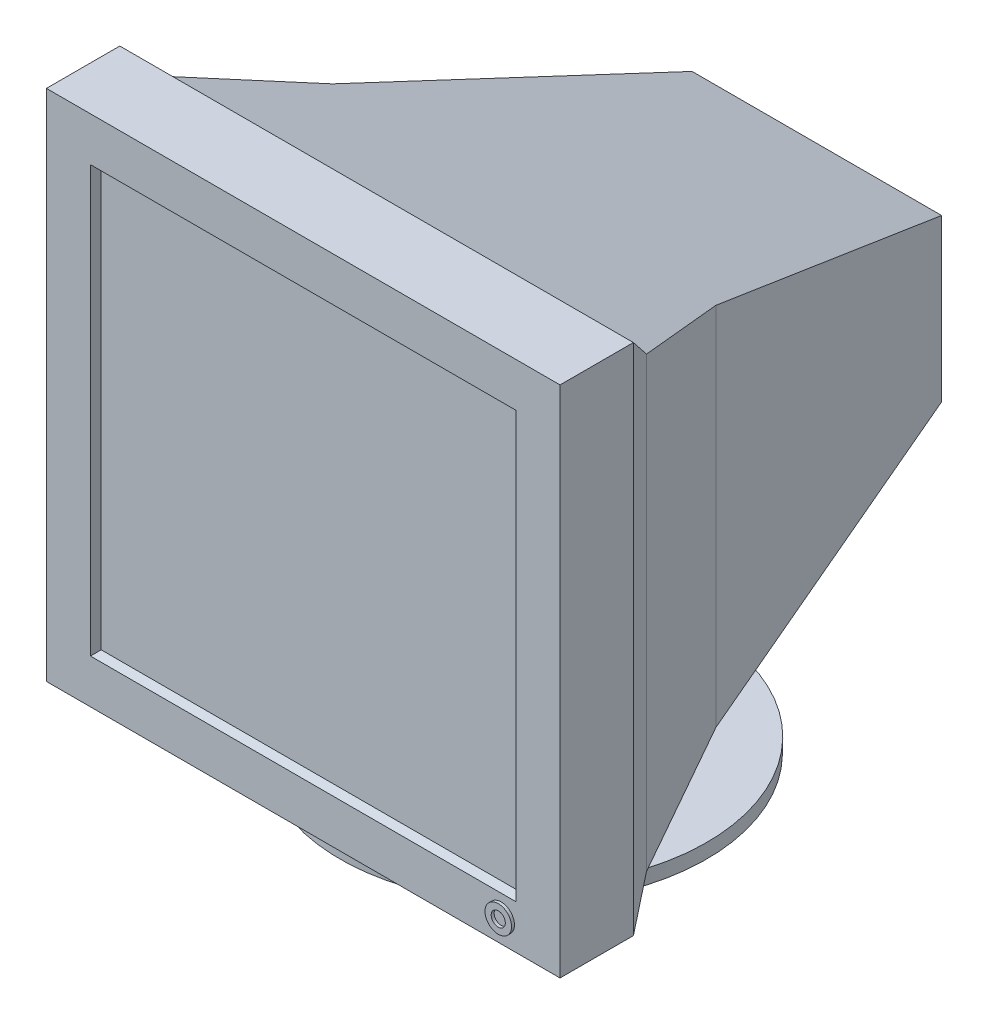
ISO-10303-21;
HEADER;
FILE_DESCRIPTION(('STEP AP214'),'2;1');
FILE_NAME('part.step','',(''),(''),'','','');
FILE_SCHEMA(('AUTOMOTIVE_DESIGN { 1 0 10303 214 1 1 1 1 }'));
ENDSEC;
DATA;
#1=APPLICATION_CONTEXT('core data for automotive mechanical design processes');
#2=APPLICATION_PROTOCOL_DEFINITION('international standard','automotive_design',2000,#1);
#3=PRODUCT_CONTEXT('',#1,'mechanical');
#4=PRODUCT('Part','Part','',(#3));
#5=PRODUCT_RELATED_PRODUCT_CATEGORY('part','',(#4));
#6=PRODUCT_DEFINITION_FORMATION('','',#4);
#7=PRODUCT_DEFINITION_CONTEXT('part definition',#1,'design');
#8=PRODUCT_DEFINITION('design','',#6,#7);
#9=PRODUCT_DEFINITION_SHAPE('','',#8);
#10=(LENGTH_UNIT() NAMED_UNIT(*) SI_UNIT(.MILLI.,.METRE.));
#11=(NAMED_UNIT(*) PLANE_ANGLE_UNIT() SI_UNIT($,.RADIAN.));
#12=(NAMED_UNIT(*) SI_UNIT($,.STERADIAN.) SOLID_ANGLE_UNIT());
#13=UNCERTAINTY_MEASURE_WITH_UNIT(LENGTH_MEASURE(1.E-05),#10,'distance_accuracy_value','');
#14=(GEOMETRIC_REPRESENTATION_CONTEXT(3) GLOBAL_UNCERTAINTY_ASSIGNED_CONTEXT((#13)) GLOBAL_UNIT_ASSIGNED_CONTEXT((#10,
#11,#12)) REPRESENTATION_CONTEXT('',''));
#15=CARTESIAN_POINT('',(0.,0.,0.));
#16=DIRECTION('',(0.,0.,1.));
#17=DIRECTION('',(1.,0.,0.));
#18=AXIS2_PLACEMENT_3D('',#15,#16,#17);
#19=CARTESIAN_POINT('',(-175.,-175.,0.));
#20=DIRECTION('',(0.,0.,1.));
#21=DIRECTION('',(1.,0.,0.));
#22=AXIS2_PLACEMENT_3D('',#19,#20,#21);
#23=PLANE('',#22);
#24=DIRECTION('',(0.,-1.,0.));
#25=VECTOR('',#24,1.);
#26=CARTESIAN_POINT('',(-175.,175.,0.));
#27=LINE('',#26,#25);
#28=CARTESIAN_POINT('',(-175.,175.,0.));
#29=VERTEX_POINT('',#28);
#30=CARTESIAN_POINT('',(-175.,-175.,0.));
#31=VERTEX_POINT('',#30);
#32=EDGE_CURVE('E194',#29,#31,#27,.T.);
#33=ORIENTED_EDGE('',*,*,#32,.T.);
#34=DIRECTION('',(1.,0.,0.));
#35=VECTOR('',#34,1.);
#36=CARTESIAN_POINT('',(-175.,-175.,0.));
#37=LINE('',#36,#35);
#38=CARTESIAN_POINT('',(175.,-175.,0.));
#39=VERTEX_POINT('',#38);
#40=EDGE_CURVE('E189',#31,#39,#37,.T.);
#41=ORIENTED_EDGE('',*,*,#40,.T.);
#42=DIRECTION('',(0.,1.,0.));
#43=VECTOR('',#42,1.);
#44=CARTESIAN_POINT('',(175.,175.,0.));
#45=LINE('',#44,#43);
#46=CARTESIAN_POINT('',(175.,175.,0.));
#47=VERTEX_POINT('',#46);
#48=EDGE_CURVE('E186',#39,#47,#45,.T.);
#49=ORIENTED_EDGE('',*,*,#48,.T.);
#50=DIRECTION('',(-1.,0.,0.));
#51=VECTOR('',#50,1.);
#52=CARTESIAN_POINT('',(-175.,175.,0.));
#53=LINE('',#52,#51);
#54=EDGE_CURVE('E175',#47,#29,#53,.T.);
#55=ORIENTED_EDGE('',*,*,#54,.T.);
#56=EDGE_LOOP('',(#33,#41,#49,#55));
#57=FACE_BOUND('',#56,.T.);
#58=DIRECTION('',(0.,-1.,0.));
#59=VECTOR('',#58,1.);
#60=CARTESIAN_POINT('',(-145.,145.,0.));
#61=LINE('',#60,#59);
#62=CARTESIAN_POINT('',(-145.,145.,0.));
#63=VERTEX_POINT('',#62);
#64=CARTESIAN_POINT('',(-145.,-145.,0.));
#65=VERTEX_POINT('',#64);
#66=EDGE_CURVE('E226',#63,#65,#61,.T.);
#67=ORIENTED_EDGE('',*,*,#66,.F.);
#68=DIRECTION('',(-1.,0.,0.));
#69=VECTOR('',#68,1.);
#70=CARTESIAN_POINT('',(-145.,145.,0.));
#71=LINE('',#70,#69);
#72=CARTESIAN_POINT('',(145.,145.,0.));
#73=VERTEX_POINT('',#72);
#74=EDGE_CURVE('E210',#73,#63,#71,.T.);
#75=ORIENTED_EDGE('',*,*,#74,.F.);
#76=DIRECTION('',(0.,1.,0.));
#77=VECTOR('',#76,1.);
#78=CARTESIAN_POINT('',(145.,145.,0.));
#79=LINE('',#78,#77);
#80=CARTESIAN_POINT('',(145.,-145.,0.));
#81=VERTEX_POINT('',#80);
#82=EDGE_CURVE('E220',#81,#73,#79,.T.);
#83=ORIENTED_EDGE('',*,*,#82,.F.);
#84=DIRECTION('',(1.,0.,0.));
#85=VECTOR('',#84,1.);
#86=CARTESIAN_POINT('',(-145.,-145.,0.));
#87=LINE('',#86,#85);
#88=EDGE_CURVE('E223',#65,#81,#87,.T.);
#89=ORIENTED_EDGE('',*,*,#88,.F.);
#90=EDGE_LOOP('',(#67,#75,#83,#89));
#91=FACE_BOUND('',#90,.T.);
#92=CARTESIAN_POINT('',(134.907856815634,-159.198773435105,0.));
#93=DIRECTION('',(0.,0.,1.));
#94=DIRECTION('',(1.,0.,0.));
#95=AXIS2_PLACEMENT_3D('',#92,#93,#94);
#96=CIRCLE('',#95,9.05214814978205);
#97=CARTESIAN_POINT('',(143.960004965416,-159.198773435105,0.));
#98=VERTEX_POINT('',#97);
#99=EDGE_CURVE('E283',#98,#98,#96,.T.);
#100=ORIENTED_EDGE('',*,*,#99,.F.);
#101=EDGE_LOOP('',(#100));
#102=FACE_BOUND('',#101,.T.);
#103=ADVANCED_FACE('F36',(#57,#91,#102),#23,.T.);
#104=CARTESIAN_POINT('',(-175.001,-152.639320225002,-70.0000000000001));
#105=DIRECTION('',(0.,0.944236985141632,0.329266633430479));
#106=DIRECTION('',(0.,-0.329266633430479,0.944236985141632));
#107=AXIS2_PLACEMENT_3D('',#104,#105,#106);
#108=PLANE('',#107);
#109=DIRECTION('',(-0.21132817758604,0.321830200268432,-0.922911546982344));
#110=VECTOR('',#109,1.);
#111=CARTESIAN_POINT('',(134.112120042509,-129.792503344486,-135.51775157593));
#112=LINE('',#111,#110);
#113=CARTESIAN_POINT('',(130.682151375034,-124.569028104331,-150.497096617182));
#114=VERTEX_POINT('',#113);
#115=CARTESIAN_POINT('',(85.,-55.,-350.));
#116=VERTEX_POINT('',#115);
#117=EDGE_CURVE('E148',#114,#116,#112,.T.);
#118=ORIENTED_EDGE('',*,*,#117,.F.);
#119=DIRECTION('',(-0.363212029246169,0.306779866075758,-0.879751746563438));
#120=VECTOR('',#119,1.);
#121=CARTESIAN_POINT('',(166.407649963602,-154.743864811246,-63.9648034952483));
#122=LINE('',#121,#120);
#123=CARTESIAN_POINT('',(163.91597435403,-152.639320225002,-70.0000000000001));
#124=VERTEX_POINT('',#123);
#125=EDGE_CURVE('E51',#124,#114,#122,.T.);
#126=ORIENTED_EDGE('',*,*,#125,.F.);
#127=DIRECTION('',(1.,0.,0.));
#128=VECTOR('',#127,1.);
#129=CARTESIAN_POINT('',(-175.001,-152.639320225002,-70.0000000000001));
#130=LINE('',#129,#128);
#131=CARTESIAN_POINT('',(-163.91597435403,-152.639320225002,-70.));
#132=VERTEX_POINT('',#131);
#133=EDGE_CURVE('E235',#132,#124,#130,.T.);
#134=ORIENTED_EDGE('',*,*,#133,.F.);
#135=DIRECTION('',(-0.363212029246169,-0.306779866075758,0.879751746563438));
#136=VECTOR('',#135,1.);
#137=CARTESIAN_POINT('',(-166.407649963602,-154.743864811246,-63.9648034952484));
#138=LINE('',#137,#136);
#139=CARTESIAN_POINT('',(-130.682151375034,-124.569028104331,-150.497096617182));
#140=VERTEX_POINT('',#139);
#141=EDGE_CURVE('E257',#140,#132,#138,.T.);
#142=ORIENTED_EDGE('',*,*,#141,.F.);
#143=DIRECTION('',(-0.21132817758604,-0.321830200268432,0.922911546982344));
#144=VECTOR('',#143,1.);
#145=CARTESIAN_POINT('',(-134.112120042509,-129.792503344486,-135.51775157593));
#146=LINE('',#145,#144);
#147=CARTESIAN_POINT('',(-85.,-55.0000000000001,-350.));
#148=VERTEX_POINT('',#147);
#149=EDGE_CURVE('E59',#148,#140,#146,.T.);
#150=ORIENTED_EDGE('',*,*,#149,.F.);
#151=DIRECTION('',(1.,0.,0.));
#152=VECTOR('',#151,1.);
#153=CARTESIAN_POINT('',(-175.001,-55.0000000000001,-350.));
#154=LINE('',#153,#152);
#155=EDGE_CURVE('E232',#148,#116,#154,.T.);
#156=ORIENTED_EDGE('',*,*,#155,.T.);
#157=EDGE_LOOP('',(#118,#126,#134,#142,#150,#156));
#158=FACE_BOUND('',#157,.T.);
#159=CARTESIAN_POINT('',(0.,-124.742371589287,-150.));
#160=DIRECTION('',(0.,0.944236985141632,0.329266633430479));
#161=DIRECTION('',(0.,0.329266633430479,-0.944236985141632));
#162=AXIS2_PLACEMENT_3D('',#159,#160,#161);
#163=ELLIPSE('',#162,56.4741564920599,53.3249872644793);
#164=CARTESIAN_POINT('',(0.,-106.147316205321,-203.324987264479));
#165=VERTEX_POINT('',#164);
#166=EDGE_CURVE('E11',#165,#165,#163,.F.);
#167=ORIENTED_EDGE('',*,*,#166,.F.);
#168=EDGE_LOOP('',(#167));
#169=FACE_BOUND('',#168,.T.);
#170=ADVANCED_FACE('F317',(#158,#169),#108,.F.);
#171=CARTESIAN_POINT('',(-175.,175.,-350.));
#172=DIRECTION('',(-1.,0.,0.));
#173=DIRECTION('',(0.,-1.,0.));
#174=AXIS2_PLACEMENT_3D('',#171,#172,#173);
#175=PLANE('',#174);
#176=DIRECTION('',(0.,1.,0.));
#177=VECTOR('',#176,1.);
#178=CARTESIAN_POINT('',(-175.,-175.001,-49.9999999999999));
#179=LINE('',#178,#177);
#180=CARTESIAN_POINT('',(-175.,-175.,-50.));
#181=VERTEX_POINT('',#180);
#182=CARTESIAN_POINT('',(-175.,175.,-49.9999999999999));
#183=VERTEX_POINT('',#182);
#184=EDGE_CURVE('E244',#181,#183,#179,.T.);
#185=ORIENTED_EDGE('',*,*,#184,.F.);
#186=DIRECTION('',(0.,0.,1.));
#187=VECTOR('',#186,1.);
#188=CARTESIAN_POINT('',(-175.,-175.,-350.));
#189=LINE('',#188,#187);
#190=EDGE_CURVE('E178',#181,#31,#189,.T.);
#191=ORIENTED_EDGE('',*,*,#190,.T.);
#192=ORIENTED_EDGE('',*,*,#32,.F.);
#193=DIRECTION('',(0.,0.,1.));
#194=VECTOR('',#193,1.);
#195=CARTESIAN_POINT('',(-175.,175.,-350.));
#196=LINE('',#195,#194);
#197=EDGE_CURVE('E44',#183,#29,#196,.T.);
#198=ORIENTED_EDGE('',*,*,#197,.F.);
#199=EDGE_LOOP('',(#185,#191,#192,#198));
#200=FACE_BOUND('',#199,.T.);
#201=ADVANCED_FACE('F38',(#200),#175,.T.);
#202=CARTESIAN_POINT('',(-175.,175.,-350.));
#203=DIRECTION('',(0.,1.,0.));
#204=DIRECTION('',(0.,0.,1.));
#205=AXIS2_PLACEMENT_3D('',#202,#203,#204);
#206=PLANE('',#205);
#207=DIRECTION('',(1.,0.,0.));
#208=VECTOR('',#207,1.);
#209=CARTESIAN_POINT('',(-175.001,175.,-50.));
#210=LINE('',#209,#208);
#211=CARTESIAN_POINT('',(175.,175.,-50.));
#212=VERTEX_POINT('',#211);
#213=EDGE_CURVE('E163',#183,#212,#210,.T.);
#214=ORIENTED_EDGE('',*,*,#213,.F.);
#215=ORIENTED_EDGE('',*,*,#197,.T.);
#216=ORIENTED_EDGE('',*,*,#54,.F.);
#217=DIRECTION('',(0.,0.,1.));
#218=VECTOR('',#217,1.);
#219=CARTESIAN_POINT('',(175.,175.,-350.));
#220=LINE('',#219,#218);
#221=EDGE_CURVE('E156',#212,#47,#220,.T.);
#222=ORIENTED_EDGE('',*,*,#221,.F.);
#223=EDGE_LOOP('',(#214,#215,#216,#222));
#224=FACE_BOUND('',#223,.T.);
#225=ADVANCED_FACE('F173',(#224),#206,.T.);
#226=CARTESIAN_POINT('',(175.,175.,-350.));
#227=DIRECTION('',(1.,0.,0.));
#228=DIRECTION('',(0.,1.,0.));
#229=AXIS2_PLACEMENT_3D('',#226,#227,#228);
#230=PLANE('',#229);
#231=DIRECTION('',(0.,1.,0.));
#232=VECTOR('',#231,1.);
#233=CARTESIAN_POINT('',(175.,-175.001,-49.9999999999999));
#234=LINE('',#233,#232);
#235=CARTESIAN_POINT('',(175.,-175.,-49.9999999999999));
#236=VERTEX_POINT('',#235);
#237=EDGE_CURVE('E140',#236,#212,#234,.T.);
#238=ORIENTED_EDGE('',*,*,#237,.T.);
#239=ORIENTED_EDGE('',*,*,#221,.T.);
#240=ORIENTED_EDGE('',*,*,#48,.F.);
#241=DIRECTION('',(0.,0.,1.));
#242=VECTOR('',#241,1.);
#243=CARTESIAN_POINT('',(175.,-175.,-350.));
#244=LINE('',#243,#242);
#245=EDGE_CURVE('E158',#236,#39,#244,.T.);
#246=ORIENTED_EDGE('',*,*,#245,.F.);
#247=EDGE_LOOP('',(#238,#239,#240,#246));
#248=FACE_BOUND('',#247,.T.);
#249=ADVANCED_FACE('F153',(#248),#230,.T.);
#250=CARTESIAN_POINT('',(-175.,-175.,-350.));
#251=DIRECTION('',(0.,-1.,0.));
#252=DIRECTION('',(0.,0.,-1.));
#253=AXIS2_PLACEMENT_3D('',#250,#251,#252);
#254=PLANE('',#253);
#255=DIRECTION('',(1.,0.,0.));
#256=VECTOR('',#255,1.);
#257=CARTESIAN_POINT('',(-175.001,-175.,-50.0000000000001));
#258=LINE('',#257,#256);
#259=EDGE_CURVE('E170',#181,#236,#258,.T.);
#260=ORIENTED_EDGE('',*,*,#259,.T.);
#261=ORIENTED_EDGE('',*,*,#245,.T.);
#262=ORIENTED_EDGE('',*,*,#40,.F.);
#263=ORIENTED_EDGE('',*,*,#190,.F.);
#264=EDGE_LOOP('',(#260,#261,#262,#263));
#265=FACE_BOUND('',#264,.T.);
#266=ADVANCED_FACE('F332',(#265),#254,.T.);
#267=CARTESIAN_POINT('',(-175.,-175.,-350.));
#268=DIRECTION('',(0.,0.,1.));
#269=DIRECTION('',(1.,0.,0.));
#270=AXIS2_PLACEMENT_3D('',#267,#268,#269);
#271=PLANE('',#270);
#272=DIRECTION('',(1.,0.,0.));
#273=VECTOR('',#272,1.);
#274=CARTESIAN_POINT('',(-175.001,54.9999999999999,-350.));
#275=LINE('',#274,#273);
#276=CARTESIAN_POINT('',(-85.,54.9999999999999,-350.));
#277=VERTEX_POINT('',#276);
#278=CARTESIAN_POINT('',(85.,54.9999999999999,-350.));
#279=VERTEX_POINT('',#278);
#280=EDGE_CURVE('E227',#277,#279,#275,.T.);
#281=ORIENTED_EDGE('',*,*,#280,.T.);
#282=DIRECTION('',(0.,1.,0.));
#283=VECTOR('',#282,1.);
#284=CARTESIAN_POINT('',(85.,-175.001,-350.));
#285=LINE('',#284,#283);
#286=EDGE_CURVE('E159',#116,#279,#285,.T.);
#287=ORIENTED_EDGE('',*,*,#286,.F.);
#288=ORIENTED_EDGE('',*,*,#155,.F.);
#289=DIRECTION('',(0.,1.,0.));
#290=VECTOR('',#289,1.);
#291=CARTESIAN_POINT('',(-85.,-175.001,-350.));
#292=LINE('',#291,#290);
#293=EDGE_CURVE('E241',#148,#277,#292,.T.);
#294=ORIENTED_EDGE('',*,*,#293,.T.);
#295=EDGE_LOOP('',(#281,#287,#288,#294));
#296=FACE_BOUND('',#295,.T.);
#297=ADVANCED_FACE('F327',(#296),#271,.F.);
#298=CARTESIAN_POINT('',(-145.,145.,0.));
#299=DIRECTION('',(-0.90630778703665,0.,-0.4226182617407));
#300=DIRECTION('',(-0.4226182617407,0.,0.90630778703665));
#301=AXIS2_PLACEMENT_3D('',#298,#299,#300);
#302=PLANE('',#301);
#303=ORIENTED_EDGE('',*,*,#66,.T.);
#304=DIRECTION('',(-0.389281620635025,-0.389281620635025,0.834817129478988));
#305=VECTOR('',#304,1.);
#306=CARTESIAN_POINT('',(-101.053347752373,-101.053347752373,-94.2438998782633));
#307=LINE('',#306,#305);
#308=CARTESIAN_POINT('',(-142.668461709225,-142.668461709225,-5.));
#309=VERTEX_POINT('',#308);
#310=EDGE_CURVE('E207',#309,#65,#307,.T.);
#311=ORIENTED_EDGE('',*,*,#310,.F.);
#312=DIRECTION('',(0.,-1.,0.));
#313=VECTOR('',#312,1.);
#314=CARTESIAN_POINT('',(-142.668461709225,-145.,-5.));
#315=LINE('',#314,#313);
#316=CARTESIAN_POINT('',(-142.668461709225,142.668461709225,-5.));
#317=VERTEX_POINT('',#316);
#318=EDGE_CURVE('E201',#317,#309,#315,.T.);
#319=ORIENTED_EDGE('',*,*,#318,.F.);
#320=DIRECTION('',(-0.389281620635025,0.389281620635025,0.834817129478988));
#321=VECTOR('',#320,1.);
#322=CARTESIAN_POINT('',(-145.,145.,0.));
#323=LINE('',#322,#321);
#324=EDGE_CURVE('E196',#317,#63,#323,.T.);
#325=ORIENTED_EDGE('',*,*,#324,.T.);
#326=EDGE_LOOP('',(#303,#311,#319,#325));
#327=FACE_BOUND('',#326,.T.);
#328=ADVANCED_FACE('F338',(#327),#302,.F.);
#329=CARTESIAN_POINT('',(-145.,145.,0.));
#330=DIRECTION('',(0.,0.90630778703665,-0.4226182617407));
#331=DIRECTION('',(0.,0.4226182617407,0.90630778703665));
#332=AXIS2_PLACEMENT_3D('',#329,#330,#331);
#333=PLANE('',#332);
#334=ORIENTED_EDGE('',*,*,#74,.T.);
#335=ORIENTED_EDGE('',*,*,#324,.F.);
#336=DIRECTION('',(-1.,0.,0.));
#337=VECTOR('',#336,1.);
#338=CARTESIAN_POINT('',(-145.,142.668461709225,-5.));
#339=LINE('',#338,#337);
#340=CARTESIAN_POINT('',(142.668461709225,142.668461709225,-5.));
#341=VERTEX_POINT('',#340);
#342=EDGE_CURVE('E204',#341,#317,#339,.T.);
#343=ORIENTED_EDGE('',*,*,#342,.F.);
#344=DIRECTION('',(0.389281620635025,0.389281620635025,0.834817129478988));
#345=VECTOR('',#344,1.);
#346=CARTESIAN_POINT('',(145.,145.,0.));
#347=LINE('',#346,#345);
#348=EDGE_CURVE('E211',#341,#73,#347,.T.);
#349=ORIENTED_EDGE('',*,*,#348,.T.);
#350=EDGE_LOOP('',(#334,#335,#343,#349));
#351=FACE_BOUND('',#350,.T.);
#352=ADVANCED_FACE('F392',(#351),#333,.F.);
#353=CARTESIAN_POINT('',(145.,145.,0.));
#354=DIRECTION('',(0.90630778703665,0.,-0.4226182617407));
#355=DIRECTION('',(-0.4226182617407,0.,-0.90630778703665));
#356=AXIS2_PLACEMENT_3D('',#353,#354,#355);
#357=PLANE('',#356);
#358=ORIENTED_EDGE('',*,*,#82,.T.);
#359=ORIENTED_EDGE('',*,*,#348,.F.);
#360=DIRECTION('',(0.,1.,0.));
#361=VECTOR('',#360,1.);
#362=CARTESIAN_POINT('',(142.668461709225,-145.,-5.));
#363=LINE('',#362,#361);
#364=CARTESIAN_POINT('',(142.668461709225,-142.668461709225,-5.));
#365=VERTEX_POINT('',#364);
#366=EDGE_CURVE('E200',#365,#341,#363,.T.);
#367=ORIENTED_EDGE('',*,*,#366,.F.);
#368=DIRECTION('',(0.389281620635025,-0.389281620635025,0.834817129478988));
#369=VECTOR('',#368,1.);
#370=CARTESIAN_POINT('',(101.053347752373,-101.053347752373,-94.2438998782634));
#371=LINE('',#370,#369);
#372=EDGE_CURVE('E213',#365,#81,#371,.T.);
#373=ORIENTED_EDGE('',*,*,#372,.T.);
#374=EDGE_LOOP('',(#358,#359,#367,#373));
#375=FACE_BOUND('',#374,.T.);
#376=ADVANCED_FACE('F396',(#375),#357,.F.);
#377=CARTESIAN_POINT('',(-145.,-145.,0.));
#378=DIRECTION('',(0.,-0.90630778703665,-0.4226182617407));
#379=DIRECTION('',(0.,0.4226182617407,-0.90630778703665));
#380=AXIS2_PLACEMENT_3D('',#377,#378,#379);
#381=PLANE('',#380);
#382=ORIENTED_EDGE('',*,*,#88,.T.);
#383=ORIENTED_EDGE('',*,*,#372,.F.);
#384=DIRECTION('',(1.,0.,0.));
#385=VECTOR('',#384,1.);
#386=CARTESIAN_POINT('',(-145.,-142.668461709225,-5.));
#387=LINE('',#386,#385);
#388=EDGE_CURVE('E197',#309,#365,#387,.T.);
#389=ORIENTED_EDGE('',*,*,#388,.F.);
#390=ORIENTED_EDGE('',*,*,#310,.T.);
#391=EDGE_LOOP('',(#382,#383,#389,#390));
#392=FACE_BOUND('',#391,.T.);
#393=ADVANCED_FACE('F388',(#392),#381,.F.);
#394=CARTESIAN_POINT('',(-145.,-145.,-5.));
#395=DIRECTION('',(0.,0.,1.));
#396=DIRECTION('',(1.,0.,0.));
#397=AXIS2_PLACEMENT_3D('',#394,#395,#396);
#398=PLANE('',#397);
#399=ORIENTED_EDGE('',*,*,#318,.T.);
#400=ORIENTED_EDGE('',*,*,#388,.T.);
#401=ORIENTED_EDGE('',*,*,#366,.T.);
#402=ORIENTED_EDGE('',*,*,#342,.T.);
#403=EDGE_LOOP('',(#399,#400,#401,#402));
#404=FACE_BOUND('',#403,.T.);
#405=ADVANCED_FACE('F383',(#404),#398,.T.);
#406=CARTESIAN_POINT('',(-175.001,152.639320225002,-70.));
#407=DIRECTION('',(0.,-0.944236985141632,0.32926663343048));
#408=DIRECTION('',(0.,-0.32926663343048,-0.944236985141632));
#409=AXIS2_PLACEMENT_3D('',#406,#407,#408);
#410=PLANE('',#409);
#411=DIRECTION('',(1.,0.,0.));
#412=VECTOR('',#411,1.);
#413=CARTESIAN_POINT('',(-175.001,152.639320225002,-70.));
#414=LINE('',#413,#412);
#415=CARTESIAN_POINT('',(-163.91597435403,152.639320225002,-70.));
#416=VERTEX_POINT('',#415);
#417=CARTESIAN_POINT('',(163.91597435403,152.639320225002,-70.));
#418=VERTEX_POINT('',#417);
#419=EDGE_CURVE('E169',#416,#418,#414,.T.);
#420=ORIENTED_EDGE('',*,*,#419,.T.);
#421=DIRECTION('',(0.363212029246169,0.306779866075759,0.879751746563438));
#422=VECTOR('',#421,1.);
#423=CARTESIAN_POINT('',(127.408278920091,121.803816403162,-158.426886322221));
#424=LINE('',#423,#422);
#425=CARTESIAN_POINT('',(130.682151375034,124.569028104331,-150.497096617182));
#426=VERTEX_POINT('',#425);
#427=EDGE_CURVE('E264',#426,#418,#424,.T.);
#428=ORIENTED_EDGE('',*,*,#427,.F.);
#429=DIRECTION('',(0.21132817758604,0.321830200268433,0.922911546982344));
#430=VECTOR('',#429,1.);
#431=CARTESIAN_POINT('',(110.307857618723,93.5411589634439,-239.475628415928));
#432=LINE('',#431,#430);
#433=EDGE_CURVE('E269',#279,#426,#432,.T.);
#434=ORIENTED_EDGE('',*,*,#433,.F.);
#435=ORIENTED_EDGE('',*,*,#280,.F.);
#436=DIRECTION('',(0.21132817758604,-0.321830200268433,-0.922911546982344));
#437=VECTOR('',#436,1.);
#438=CARTESIAN_POINT('',(-110.307857618723,93.5411589634438,-239.475628415928));
#439=LINE('',#438,#437);
#440=CARTESIAN_POINT('',(-130.682151375034,124.569028104331,-150.497096617182));
#441=VERTEX_POINT('',#440);
#442=EDGE_CURVE('E251',#441,#277,#439,.T.);
#443=ORIENTED_EDGE('',*,*,#442,.F.);
#444=DIRECTION('',(0.363212029246169,-0.306779866075759,-0.879751746563438));
#445=VECTOR('',#444,1.);
#446=CARTESIAN_POINT('',(-127.408278920091,121.803816403162,-158.426886322221));
#447=LINE('',#446,#445);
#448=EDGE_CURVE('E253',#416,#441,#447,.T.);
#449=ORIENTED_EDGE('',*,*,#448,.F.);
#450=EDGE_LOOP('',(#420,#428,#434,#435,#443,#449));
#451=FACE_BOUND('',#450,.T.);
#452=ADVANCED_FACE('F356',(#451),#410,.F.);
#453=CARTESIAN_POINT('',(-175.001,175.,-50.));
#454=DIRECTION('',(0.,-0.666666666666667,0.74535599249993));
#455=DIRECTION('',(0.,-0.74535599249993,-0.666666666666667));
#456=AXIS2_PLACEMENT_3D('',#453,#454,#455);
#457=PLANE('',#456);
#458=ORIENTED_EDGE('',*,*,#213,.T.);
#459=DIRECTION('',(0.346569510674344,0.699162027903144,0.625349528671214));
#460=VECTOR('',#459,1.);
#461=CARTESIAN_POINT('',(90.1918730293921,3.909871730886,-203.027662835559));
#462=LINE('',#461,#460);
#463=EDGE_CURVE('E136',#418,#212,#462,.T.);
#464=ORIENTED_EDGE('',*,*,#463,.F.);
#465=ORIENTED_EDGE('',*,*,#419,.F.);
#466=DIRECTION('',(0.346569510674344,-0.699162027903144,-0.625349528671214));
#467=VECTOR('',#466,1.);
#468=CARTESIAN_POINT('',(-90.1918730293921,3.90987173088603,-203.027662835559));
#469=LINE('',#468,#467);
#470=EDGE_CURVE('E166',#183,#416,#469,.T.);
#471=ORIENTED_EDGE('',*,*,#470,.F.);
#472=EDGE_LOOP('',(#458,#464,#465,#471));
#473=FACE_BOUND('',#472,.T.);
#474=ADVANCED_FACE('F164',(#473),#457,.F.);
#475=CARTESIAN_POINT('',(-175.001,-175.,-50.0000000000001));
#476=DIRECTION('',(0.,0.666666666666667,0.74535599249993));
#477=DIRECTION('',(0.,-0.74535599249993,0.666666666666667));
#478=AXIS2_PLACEMENT_3D('',#475,#476,#477);
#479=PLANE('',#478);
#480=ORIENTED_EDGE('',*,*,#133,.T.);
#481=DIRECTION('',(-0.346569510674344,0.699162027903144,-0.625349528671214));
#482=VECTOR('',#481,1.);
#483=CARTESIAN_POINT('',(175.000242308242,-175.000488827541,-49.9995627793553));
#484=LINE('',#483,#482);
#485=EDGE_CURVE('E261',#236,#124,#484,.T.);
#486=ORIENTED_EDGE('',*,*,#485,.F.);
#487=ORIENTED_EDGE('',*,*,#259,.F.);
#488=DIRECTION('',(-0.346569510674344,-0.699162027903144,0.625349528671214));
#489=VECTOR('',#488,1.);
#490=CARTESIAN_POINT('',(-175.000242308242,-175.000488827541,-49.9995627793554));
#491=LINE('',#490,#489);
#492=EDGE_CURVE('E245',#132,#181,#491,.T.);
#493=ORIENTED_EDGE('',*,*,#492,.F.);
#494=EDGE_LOOP('',(#480,#486,#487,#493));
#495=FACE_BOUND('',#494,.T.);
#496=ADVANCED_FACE('F343',(#495),#479,.F.);
#497=CARTESIAN_POINT('',(-130.682151375034,-175.001,-150.497096617182));
#498=DIRECTION('',(0.974771946063821,0.,0.223203165674126));
#499=DIRECTION('',(0.223203165674126,0.,-0.974771946063821));
#500=AXIS2_PLACEMENT_3D('',#497,#498,#499);
#501=PLANE('',#500);
#502=ORIENTED_EDGE('',*,*,#442,.T.);
#503=ORIENTED_EDGE('',*,*,#293,.F.);
#504=ORIENTED_EDGE('',*,*,#149,.T.);
#505=DIRECTION('',(0.,1.,0.));
#506=VECTOR('',#505,1.);
#507=CARTESIAN_POINT('',(-130.682151375034,-175.001,-150.497096617182));
#508=LINE('',#507,#506);
#509=EDGE_CURVE('E236',#140,#441,#508,.T.);
#510=ORIENTED_EDGE('',*,*,#509,.T.);
#511=EDGE_LOOP('',(#502,#503,#504,#510));
#512=FACE_BOUND('',#511,.T.);
#513=ADVANCED_FACE('F374',(#512),#501,.F.);
#514=CARTESIAN_POINT('',(-163.91597435403,-175.001,-70.));
#515=DIRECTION('',(0.924322099135079,0.,0.381613229658671));
#516=DIRECTION('',(0.381613229658671,0.,-0.924322099135079));
#517=AXIS2_PLACEMENT_3D('',#514,#515,#516);
#518=PLANE('',#517);
#519=ORIENTED_EDGE('',*,*,#448,.T.);
#520=ORIENTED_EDGE('',*,*,#509,.F.);
#521=ORIENTED_EDGE('',*,*,#141,.T.);
#522=DIRECTION('',(0.,1.,0.));
#523=VECTOR('',#522,1.);
#524=CARTESIAN_POINT('',(-163.91597435403,-175.001,-70.));
#525=LINE('',#524,#523);
#526=EDGE_CURVE('E247',#132,#416,#525,.T.);
#527=ORIENTED_EDGE('',*,*,#526,.T.);
#528=EDGE_LOOP('',(#519,#520,#521,#527));
#529=FACE_BOUND('',#528,.T.);
#530=ADVANCED_FACE('F368',(#529),#518,.F.);
#531=CARTESIAN_POINT('',(-175.,-175.001,-49.9999999999999));
#532=DIRECTION('',(0.874659673239189,0.,0.484737512483937));
#533=DIRECTION('',(0.484737512483938,0.,-0.874659673239189));
#534=AXIS2_PLACEMENT_3D('',#531,#532,#533);
#535=PLANE('',#534);
#536=ORIENTED_EDGE('',*,*,#470,.T.);
#537=ORIENTED_EDGE('',*,*,#526,.F.);
#538=ORIENTED_EDGE('',*,*,#492,.T.);
#539=ORIENTED_EDGE('',*,*,#184,.T.);
#540=EDGE_LOOP('',(#536,#537,#538,#539));
#541=FACE_BOUND('',#540,.T.);
#542=ADVANCED_FACE('F361',(#541),#535,.F.);
#543=CARTESIAN_POINT('',(163.91597435403,-175.001,-70.));
#544=DIRECTION('',(-0.924322099135079,0.,0.381613229658671));
#545=DIRECTION('',(0.381613229658671,0.,0.924322099135079));
#546=AXIS2_PLACEMENT_3D('',#543,#544,#545);
#547=PLANE('',#546);
#548=ORIENTED_EDGE('',*,*,#427,.T.);
#549=DIRECTION('',(0.,1.,0.));
#550=VECTOR('',#549,1.);
#551=CARTESIAN_POINT('',(163.91597435403,-175.001,-70.));
#552=LINE('',#551,#550);
#553=EDGE_CURVE('E142',#124,#418,#552,.T.);
#554=ORIENTED_EDGE('',*,*,#553,.F.);
#555=ORIENTED_EDGE('',*,*,#125,.T.);
#556=DIRECTION('',(0.,1.,0.));
#557=VECTOR('',#556,1.);
#558=CARTESIAN_POINT('',(130.682151375034,-175.001,-150.497096617182));
#559=LINE('',#558,#557);
#560=EDGE_CURVE('E263',#114,#426,#559,.T.);
#561=ORIENTED_EDGE('',*,*,#560,.T.);
#562=EDGE_LOOP('',(#548,#554,#555,#561));
#563=FACE_BOUND('',#562,.T.);
#564=ADVANCED_FACE('F359',(#563),#547,.F.);
#565=CARTESIAN_POINT('',(130.682151375034,-175.001,-150.497096617182));
#566=DIRECTION('',(-0.974771946063821,0.,0.223203165674126));
#567=DIRECTION('',(0.223203165674126,0.,0.974771946063821));
#568=AXIS2_PLACEMENT_3D('',#565,#566,#567);
#569=PLANE('',#568);
#570=ORIENTED_EDGE('',*,*,#433,.T.);
#571=ORIENTED_EDGE('',*,*,#560,.F.);
#572=ORIENTED_EDGE('',*,*,#117,.T.);
#573=ORIENTED_EDGE('',*,*,#286,.T.);
#574=EDGE_LOOP('',(#570,#571,#572,#573));
#575=FACE_BOUND('',#574,.T.);
#576=ADVANCED_FACE('F351',(#575),#569,.F.);
#577=CARTESIAN_POINT('',(175.,-175.001,-49.9999999999999));
#578=DIRECTION('',(-0.874659673239189,0.,0.484737512483937));
#579=DIRECTION('',(0.484737512483938,0.,0.874659673239189));
#580=AXIS2_PLACEMENT_3D('',#577,#578,#579);
#581=PLANE('',#580);
#582=ORIENTED_EDGE('',*,*,#463,.T.);
#583=ORIENTED_EDGE('',*,*,#237,.F.);
#584=ORIENTED_EDGE('',*,*,#485,.T.);
#585=ORIENTED_EDGE('',*,*,#553,.T.);
#586=EDGE_LOOP('',(#582,#583,#584,#585));
#587=FACE_BOUND('',#586,.T.);
#588=ADVANCED_FACE('F138',(#587),#581,.F.);
#589=CARTESIAN_POINT('',(0.,-195.,-150.));
#590=DIRECTION('',(0.,1.,0.));
#591=DIRECTION('',(0.,0.,1.));
#592=AXIS2_PLACEMENT_3D('',#589,#590,#591);
#593=CYLINDRICAL_SURFACE('',#592,53.3249872644793);
#594=CARTESIAN_POINT('',(0.,-195.,-150.));
#595=DIRECTION('',(0.,-1.,0.));
#596=DIRECTION('',(0.,0.,-1.));
#597=AXIS2_PLACEMENT_3D('',#594,#595,#596);
#598=CIRCLE('',#597,53.3249872644793);
#599=CARTESIAN_POINT('',(0.,-195.,-203.324987264479));
#600=VERTEX_POINT('',#599);
#601=EDGE_CURVE('E149',#600,#600,#598,.T.);
#602=ORIENTED_EDGE('',*,*,#601,.F.);
#603=EDGE_LOOP('',(#602));
#604=FACE_BOUND('',#603,.T.);
#605=ORIENTED_EDGE('',*,*,#166,.T.);
#606=EDGE_LOOP('',(#605));
#607=FACE_BOUND('',#606,.T.);
#608=ADVANCED_FACE('F471',(#604,#607),#593,.T.);
#609=CARTESIAN_POINT('',(0.,-195.,-150.));
#610=DIRECTION('',(0.,-1.,0.));
#611=DIRECTION('',(0.,0.,-1.));
#612=AXIS2_PLACEMENT_3D('',#609,#610,#611);
#613=PLANE('',#612);
#614=CARTESIAN_POINT('',(0.,-195.,-150.));
#615=DIRECTION('',(0.,-1.,0.));
#616=DIRECTION('',(0.,0.,-1.));
#617=AXIS2_PLACEMENT_3D('',#614,#615,#616);
#618=CIRCLE('',#617,125.);
#619=CARTESIAN_POINT('',(0.,-195.,-275.));
#620=VERTEX_POINT('',#619);
#621=EDGE_CURVE('E279',#620,#620,#618,.T.);
#622=ORIENTED_EDGE('',*,*,#621,.F.);
#623=EDGE_LOOP('',(#622));
#624=FACE_BOUND('',#623,.T.);
#625=ORIENTED_EDGE('',*,*,#601,.T.);
#626=EDGE_LOOP('',(#625));
#627=FACE_BOUND('',#626,.T.);
#628=ADVANCED_FACE('F486',(#624,#627),#613,.F.);
#629=CARTESIAN_POINT('',(0.,-195.,-150.));
#630=DIRECTION('',(0.,1.,0.));
#631=DIRECTION('',(0.,0.,-1.));
#632=AXIS2_PLACEMENT_3D('',#629,#630,#631);
#633=CONICAL_SURFACE('',#632,125.,0.0174532925199434);
#634=CARTESIAN_POINT('',(0.,-205.,-150.));
#635=DIRECTION('',(0.,-1.,0.));
#636=DIRECTION('',(0.,0.,-1.));
#637=AXIS2_PLACEMENT_3D('',#634,#635,#636);
#638=CIRCLE('',#637,124.825449350718);
#639=CARTESIAN_POINT('',(0.,-205.,-274.825449350718));
#640=VERTEX_POINT('',#639);
#641=EDGE_CURVE('E276',#640,#640,#638,.T.);
#642=ORIENTED_EDGE('',*,*,#641,.F.);
#643=EDGE_LOOP('',(#642));
#644=FACE_BOUND('',#643,.T.);
#645=ORIENTED_EDGE('',*,*,#621,.T.);
#646=EDGE_LOOP('',(#645));
#647=FACE_BOUND('',#646,.T.);
#648=ADVANCED_FACE('F496',(#644,#647),#633,.T.);
#649=CARTESIAN_POINT('',(0.,-205.,-150.));
#650=DIRECTION('',(0.,-1.,0.));
#651=DIRECTION('',(0.,0.,-1.));
#652=AXIS2_PLACEMENT_3D('',#649,#650,#651);
#653=PLANE('',#652);
#654=ORIENTED_EDGE('',*,*,#641,.T.);
#655=EDGE_LOOP('',(#654));
#656=FACE_BOUND('',#655,.T.);
#657=ADVANCED_FACE('F312',(#656),#653,.T.);
#658=CARTESIAN_POINT('',(134.907856815634,-159.198773435105,2.));
#659=DIRECTION('',(0.,0.,-1.));
#660=DIRECTION('',(-1.,0.,0.));
#661=AXIS2_PLACEMENT_3D('',#658,#659,#660);
#662=CYLINDRICAL_SURFACE('',#661,9.05214814978205);
#663=CARTESIAN_POINT('',(134.907856815634,-159.198773435105,2.));
#664=DIRECTION('',(0.,0.,1.));
#665=DIRECTION('',(1.,0.,0.));
#666=AXIS2_PLACEMENT_3D('',#663,#664,#665);
#667=CIRCLE('',#666,9.05214814978205);
#668=CARTESIAN_POINT('',(143.960004965416,-159.198773435105,2.));
#669=VERTEX_POINT('',#668);
#670=EDGE_CURVE('E282',#669,#669,#667,.T.);
#671=ORIENTED_EDGE('',*,*,#670,.F.);
#672=EDGE_LOOP('',(#671));
#673=FACE_BOUND('',#672,.T.);
#674=ORIENTED_EDGE('',*,*,#99,.T.);
#675=EDGE_LOOP('',(#674));
#676=FACE_BOUND('',#675,.T.);
#677=ADVANCED_FACE('F306',(#673,#676),#662,.T.);
#678=CARTESIAN_POINT('',(134.907856815634,-159.198773435105,2.));
#679=DIRECTION('',(0.,0.,1.));
#680=DIRECTION('',(1.,0.,0.));
#681=AXIS2_PLACEMENT_3D('',#678,#679,#680);
#682=PLANE('',#681);
#683=CARTESIAN_POINT('',(134.907856815634,-159.198773435105,2.));
#684=DIRECTION('',(0.,0.,1.));
#685=DIRECTION('',(1.,0.,0.));
#686=AXIS2_PLACEMENT_3D('',#683,#684,#685);
#687=CIRCLE('',#686,4.81797231824524);
#688=CARTESIAN_POINT('',(139.725829133879,-159.198773435105,2.));
#689=VERTEX_POINT('',#688);
#690=EDGE_CURVE('E289',#689,#689,#687,.T.);
#691=ORIENTED_EDGE('',*,*,#690,.F.);
#692=EDGE_LOOP('',(#691));
#693=FACE_BOUND('',#692,.T.);
#694=ORIENTED_EDGE('',*,*,#670,.T.);
#695=EDGE_LOOP('',(#694));
#696=FACE_BOUND('',#695,.T.);
#697=ADVANCED_FACE('F300',(#693,#696),#682,.T.);
#698=CARTESIAN_POINT('',(134.907856815634,-159.198773435105,0.));
#699=DIRECTION('',(0.,0.,1.));
#700=DIRECTION('',(1.,0.,0.));
#701=AXIS2_PLACEMENT_3D('',#698,#699,#700);
#702=CYLINDRICAL_SURFACE('',#701,4.81797231824524);
#703=CARTESIAN_POINT('',(134.907856815634,-159.198773435105,0.));
#704=DIRECTION('',(0.,0.,1.));
#705=DIRECTION('',(1.,0.,0.));
#706=AXIS2_PLACEMENT_3D('',#703,#704,#705);
#707=CIRCLE('',#706,4.81797231824524);
#708=CARTESIAN_POINT('',(139.725829133879,-159.198773435105,0.));
#709=VERTEX_POINT('',#708);
#710=EDGE_CURVE('E286',#709,#709,#707,.T.);
#711=ORIENTED_EDGE('',*,*,#710,.F.);
#712=EDGE_LOOP('',(#711));
#713=FACE_BOUND('',#712,.T.);
#714=ORIENTED_EDGE('',*,*,#690,.T.);
#715=EDGE_LOOP('',(#714));
#716=FACE_BOUND('',#715,.T.);
#717=ADVANCED_FACE('F297',(#713,#716),#702,.F.);
#718=CARTESIAN_POINT('',(134.907856815634,-159.198773435105,0.));
#719=DIRECTION('',(0.,0.,1.));
#720=DIRECTION('',(1.,0.,0.));
#721=AXIS2_PLACEMENT_3D('',#718,#719,#720);
#722=PLANE('',#721);
#723=ORIENTED_EDGE('',*,*,#710,.T.);
#724=EDGE_LOOP('',(#723));
#725=FACE_BOUND('',#724,.T.);
#726=ADVANCED_FACE('F295',(#725),#722,.T.);
#727=CLOSED_SHELL('',(#103,#170,#201,#225,#249,#266,#297,#328,#352,#376,#393,#405,#452,#474,
#496,#513,#530,#542,#564,#576,#588,#608,#628,#648,#657,#677,#697,#717,#726));
#728=MANIFOLD_SOLID_BREP('B2',#727);
#729=ADVANCED_BREP_SHAPE_REPRESENTATION('',(#18,#728),#14);
#730=SHAPE_DEFINITION_REPRESENTATION(#9,#729);
ENDSEC;
END-ISO-10303-21;
